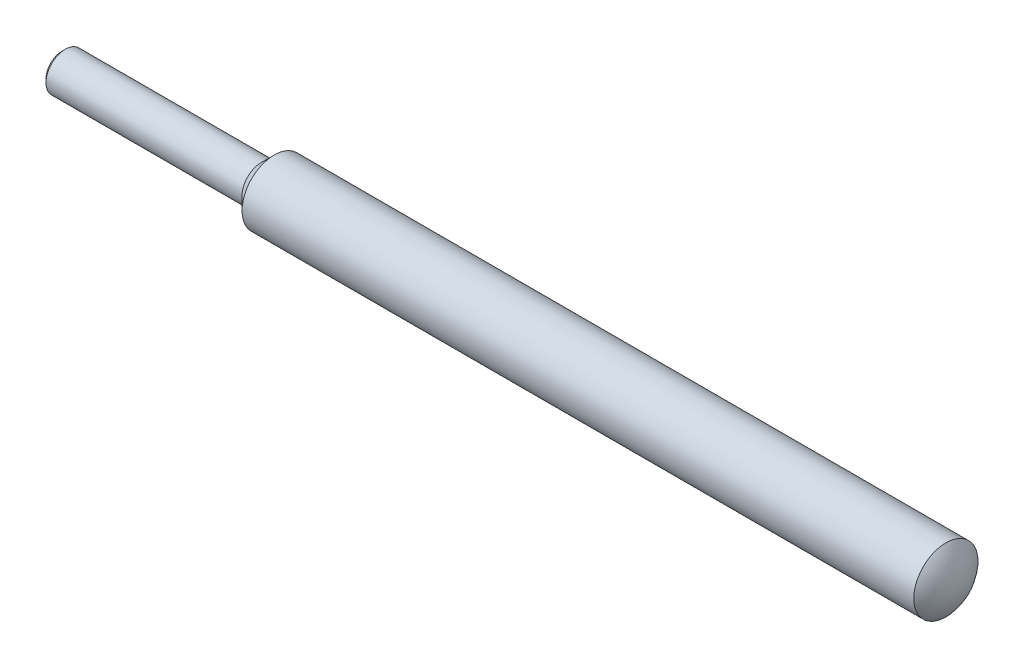
ISO-10303-21;
HEADER;
FILE_DESCRIPTION(('STEP AP214'),'2;1');
FILE_NAME('part.step','',(''),(''),'','','');
FILE_SCHEMA(('AUTOMOTIVE_DESIGN { 1 0 10303 214 1 1 1 1 }'));
ENDSEC;
DATA;
#1=APPLICATION_CONTEXT('core data for automotive mechanical design processes');
#2=APPLICATION_PROTOCOL_DEFINITION('international standard','automotive_design',2000,#1);
#3=PRODUCT_CONTEXT('',#1,'mechanical');
#4=PRODUCT('Part','Part','',(#3));
#5=PRODUCT_RELATED_PRODUCT_CATEGORY('part','',(#4));
#6=PRODUCT_DEFINITION_FORMATION('','',#4);
#7=PRODUCT_DEFINITION_CONTEXT('part definition',#1,'design');
#8=PRODUCT_DEFINITION('design','',#6,#7);
#9=PRODUCT_DEFINITION_SHAPE('','',#8);
#10=(LENGTH_UNIT() NAMED_UNIT(*) SI_UNIT(.MILLI.,.METRE.));
#11=(NAMED_UNIT(*) PLANE_ANGLE_UNIT() SI_UNIT($,.RADIAN.));
#12=(NAMED_UNIT(*) SI_UNIT($,.STERADIAN.) SOLID_ANGLE_UNIT());
#13=UNCERTAINTY_MEASURE_WITH_UNIT(LENGTH_MEASURE(1.E-05),#10,'distance_accuracy_value','');
#14=(GEOMETRIC_REPRESENTATION_CONTEXT(3) GLOBAL_UNCERTAINTY_ASSIGNED_CONTEXT((#13)) GLOBAL_UNIT_ASSIGNED_CONTEXT((#10,
#11,#12)) REPRESENTATION_CONTEXT('',''));
#15=CARTESIAN_POINT('',(0.,0.,0.));
#16=DIRECTION('',(0.,0.,1.));
#17=DIRECTION('',(1.,0.,0.));
#18=AXIS2_PLACEMENT_3D('',#15,#16,#17);
#19=CARTESIAN_POINT('',(0.,6.,0.));
#20=DIRECTION('',(1.,0.,0.));
#21=DIRECTION('',(0.,0.,-1.));
#22=AXIS2_PLACEMENT_3D('',#19,#20,#21);
#23=PLANE('',#22);
#24=CARTESIAN_POINT('',(0.,0.,0.));
#25=DIRECTION('',(1.,0.,0.));
#26=DIRECTION('',(0.,0.,-1.));
#27=AXIS2_PLACEMENT_3D('',#24,#25,#26);
#28=CIRCLE('',#27,4.99999999999998);
#29=CARTESIAN_POINT('',(0.,0.,-4.99999999999998));
#30=VERTEX_POINT('',#29);
#31=EDGE_CURVE('E45',#30,#30,#28,.F.);
#32=ORIENTED_EDGE('',*,*,#31,.T.);
#33=EDGE_LOOP('',(#32));
#34=FACE_BOUND('',#33,.T.);
#35=ADVANCED_FACE('F37',(#34),#23,.F.);
#36=CARTESIAN_POINT('',(0.,0.,0.));
#37=DIRECTION('',(-1.,0.,0.));
#38=DIRECTION('',(0.,0.,1.));
#39=AXIS2_PLACEMENT_3D('',#36,#37,#38);
#40=CYLINDRICAL_SURFACE('',#39,6.);
#41=CARTESIAN_POINT('',(1.00000000000002,0.,0.));
#42=DIRECTION('',(1.,0.,0.));
#43=DIRECTION('',(0.,0.,-1.));
#44=AXIS2_PLACEMENT_3D('',#41,#42,#43);
#45=CIRCLE('',#44,6.);
#46=CARTESIAN_POINT('',(1.00000000000002,0.,-6.));
#47=VERTEX_POINT('',#46);
#48=EDGE_CURVE('E10',#47,#47,#45,.T.);
#49=ORIENTED_EDGE('',*,*,#48,.T.);
#50=EDGE_LOOP('',(#49));
#51=FACE_BOUND('',#50,.T.);
#52=CARTESIAN_POINT('',(62.,0.,0.));
#53=DIRECTION('',(-1.,0.,0.));
#54=DIRECTION('',(0.,0.,1.));
#55=AXIS2_PLACEMENT_3D('',#52,#53,#54);
#56=CIRCLE('',#55,6.00000000000001);
#57=CARTESIAN_POINT('',(62.,0.,6.00000000000001));
#58=VERTEX_POINT('',#57);
#59=EDGE_CURVE('E49',#58,#58,#56,.T.);
#60=ORIENTED_EDGE('',*,*,#59,.T.);
#61=EDGE_LOOP('',(#60));
#62=FACE_BOUND('',#61,.T.);
#63=ADVANCED_FACE('F76',(#51,#62),#40,.T.);
#64=CARTESIAN_POINT('',(65.9999999999999,0.,0.));
#65=DIRECTION('',(1.,0.,0.));
#66=DIRECTION('',(0.,0.,-1.));
#67=AXIS2_PLACEMENT_3D('',#64,#65,#66);
#68=CONICAL_SURFACE('',#67,9.99999999999997,0.785398163397451);
#69=ORIENTED_EDGE('',*,*,#59,.F.);
#70=EDGE_LOOP('',(#69));
#71=FACE_BOUND('',#70,.T.);
#72=CARTESIAN_POINT('',(65.9999999999999,0.,0.));
#73=DIRECTION('',(-1.,0.,0.));
#74=DIRECTION('',(0.,0.,1.));
#75=AXIS2_PLACEMENT_3D('',#72,#73,#74);
#76=CIRCLE('',#75,9.99999999999997);
#77=CARTESIAN_POINT('',(65.9999999999999,0.,9.99999999999997));
#78=VERTEX_POINT('',#77);
#79=EDGE_CURVE('E53',#78,#78,#76,.T.);
#80=ORIENTED_EDGE('',*,*,#79,.T.);
#81=EDGE_LOOP('',(#80));
#82=FACE_BOUND('',#81,.T.);
#83=ADVANCED_FACE('F72',(#71,#82),#68,.T.);
#84=CARTESIAN_POINT('',(0.,0.,0.));
#85=DIRECTION('',(-1.,0.,0.));
#86=DIRECTION('',(0.,0.,1.));
#87=AXIS2_PLACEMENT_3D('',#84,#85,#86);
#88=CYLINDRICAL_SURFACE('',#87,9.99999999999999);
#89=ORIENTED_EDGE('',*,*,#79,.F.);
#90=EDGE_LOOP('',(#89));
#91=FACE_BOUND('',#90,.T.);
#92=CARTESIAN_POINT('',(275.,0.,0.));
#93=DIRECTION('',(-1.,0.,0.));
#94=DIRECTION('',(0.,0.,1.));
#95=AXIS2_PLACEMENT_3D('',#92,#93,#94);
#96=CIRCLE('',#95,10.);
#97=CARTESIAN_POINT('',(275.,0.,10.));
#98=VERTEX_POINT('',#97);
#99=EDGE_CURVE('E58',#98,#98,#96,.T.);
#100=ORIENTED_EDGE('',*,*,#99,.T.);
#101=EDGE_LOOP('',(#100));
#102=FACE_BOUND('',#101,.T.);
#103=ADVANCED_FACE('F62',(#91,#102),#88,.T.);
#104=CARTESIAN_POINT('',(263.819660112501,0.,0.));
#105=DIRECTION('',(-1.,0.,0.));
#106=DIRECTION('',(0.,1.,0.));
#107=AXIS2_PLACEMENT_3D('',#104,#105,#106);
#108=SPHERICAL_SURFACE('',#107,15.);
#109=ORIENTED_EDGE('',*,*,#99,.F.);
#110=EDGE_LOOP('',(#109));
#111=FACE_BOUND('',#110,.T.);
#112=ADVANCED_FACE('F64',(#111),#108,.T.);
#113=CARTESIAN_POINT('',(0.,0.,0.));
#114=DIRECTION('',(1.,0.,0.));
#115=DIRECTION('',(0.,0.,-1.));
#116=AXIS2_PLACEMENT_3D('',#113,#114,#115);
#117=CONICAL_SURFACE('',#116,4.99999999999998,0.785398163397452);
#118=ORIENTED_EDGE('',*,*,#48,.F.);
#119=EDGE_LOOP('',(#118));
#120=FACE_BOUND('',#119,.T.);
#121=ORIENTED_EDGE('',*,*,#31,.F.);
#122=EDGE_LOOP('',(#121));
#123=FACE_BOUND('',#122,.T.);
#124=ADVANCED_FACE('F40',(#120,#123),#117,.T.);
#125=CLOSED_SHELL('',(#35,#63,#83,#103,#112,#124));
#126=MANIFOLD_SOLID_BREP('B2',#125);
#127=ADVANCED_BREP_SHAPE_REPRESENTATION('',(#18,#126),#14);
#128=SHAPE_DEFINITION_REPRESENTATION(#9,#127);
ENDSEC;
END-ISO-10303-21;
